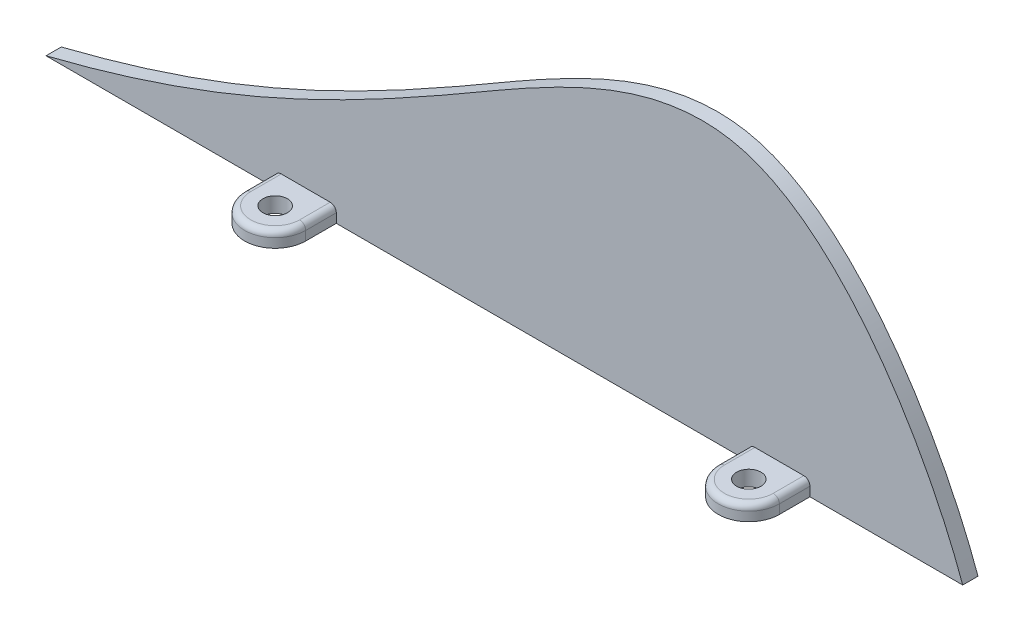
ISO-10303-21;
HEADER;
FILE_DESCRIPTION(('STEP AP214'),'2;1');
FILE_NAME('part.step','',(''),(''),'','','');
FILE_SCHEMA(('AUTOMOTIVE_DESIGN { 1 0 10303 214 1 1 1 1 }'));
ENDSEC;
DATA;
#1=APPLICATION_CONTEXT('core data for automotive mechanical design processes');
#2=APPLICATION_PROTOCOL_DEFINITION('international standard','automotive_design',2000,#1);
#3=PRODUCT_CONTEXT('',#1,'mechanical');
#4=PRODUCT('Part','Part','',(#3));
#5=PRODUCT_RELATED_PRODUCT_CATEGORY('part','',(#4));
#6=PRODUCT_DEFINITION_FORMATION('','',#4);
#7=PRODUCT_DEFINITION_CONTEXT('part definition',#1,'design');
#8=PRODUCT_DEFINITION('design','',#6,#7);
#9=PRODUCT_DEFINITION_SHAPE('','',#8);
#10=(LENGTH_UNIT() NAMED_UNIT(*) SI_UNIT(.MILLI.,.METRE.));
#11=(NAMED_UNIT(*) PLANE_ANGLE_UNIT() SI_UNIT($,.RADIAN.));
#12=(NAMED_UNIT(*) SI_UNIT($,.STERADIAN.) SOLID_ANGLE_UNIT());
#13=UNCERTAINTY_MEASURE_WITH_UNIT(LENGTH_MEASURE(1.E-05),#10,'distance_accuracy_value','');
#14=(GEOMETRIC_REPRESENTATION_CONTEXT(3) GLOBAL_UNCERTAINTY_ASSIGNED_CONTEXT((#13)) GLOBAL_UNIT_ASSIGNED_CONTEXT((#10,
#11,#12)) REPRESENTATION_CONTEXT('',''));
#15=CARTESIAN_POINT('',(0.,0.,0.));
#16=DIRECTION('',(0.,0.,1.));
#17=DIRECTION('',(1.,0.,0.));
#18=AXIS2_PLACEMENT_3D('',#15,#16,#17);
#19=CARTESIAN_POINT('',(36.,-15.5,-4.));
#20=DIRECTION('',(0.,-1.,0.));
#21=DIRECTION('',(0.,0.,-1.));
#22=AXIS2_PLACEMENT_3D('',#19,#20,#21);
#23=CYLINDRICAL_SURFACE('',#22,4.);
#24=DIRECTION('',(0.,-1.,0.));
#25=VECTOR('',#24,1.);
#26=CARTESIAN_POINT('',(32.,-17.5,-4.));
#27=LINE('',#26,#25);
#28=CARTESIAN_POINT('',(32.,-16.3,-4.));
#29=VERTEX_POINT('',#28);
#30=CARTESIAN_POINT('',(32.,-17.5,-4.));
#31=VERTEX_POINT('',#30);
#32=EDGE_CURVE('E275',#29,#31,#27,.T.);
#33=ORIENTED_EDGE('',*,*,#32,.F.);
#34=CARTESIAN_POINT('',(36.,-16.3,-4.));
#35=DIRECTION('',(0.,1.,0.));
#36=DIRECTION('',(-1.,0.,0.));
#37=AXIS2_PLACEMENT_3D('',#34,#35,#36);
#38=CIRCLE('',#37,4.);
#39=CARTESIAN_POINT('',(40.,-16.3,-4.));
#40=VERTEX_POINT('',#39);
#41=EDGE_CURVE('E323',#29,#40,#38,.F.);
#42=ORIENTED_EDGE('',*,*,#41,.T.);
#43=DIRECTION('',(0.,-1.,0.));
#44=VECTOR('',#43,1.);
#45=CARTESIAN_POINT('',(40.,-17.5,-4.));
#46=LINE('',#45,#44);
#47=CARTESIAN_POINT('',(40.,-17.5,-4.));
#48=VERTEX_POINT('',#47);
#49=EDGE_CURVE('E277',#48,#40,#46,.F.);
#50=ORIENTED_EDGE('',*,*,#49,.F.);
#51=CARTESIAN_POINT('',(36.,-17.5,-4.));
#52=DIRECTION('',(0.,1.,0.));
#53=DIRECTION('',(0.,0.,1.));
#54=AXIS2_PLACEMENT_3D('',#51,#52,#53);
#55=CIRCLE('',#54,4.);
#56=EDGE_CURVE('E280',#31,#48,#55,.F.);
#57=ORIENTED_EDGE('',*,*,#56,.F.);
#58=EDGE_LOOP('',(#33,#42,#50,#57));
#59=FACE_BOUND('',#58,.T.);
#60=ADVANCED_FACE('F35',(#59),#23,.T.);
#61=CARTESIAN_POINT('',(-26.,-15.5,-4.));
#62=DIRECTION('',(0.,-1.,0.));
#63=DIRECTION('',(0.,0.,-1.));
#64=AXIS2_PLACEMENT_3D('',#61,#62,#63);
#65=CYLINDRICAL_SURFACE('',#64,4.);
#66=DIRECTION('',(0.,-1.,0.));
#67=VECTOR('',#66,1.);
#68=CARTESIAN_POINT('',(-30.,-17.5,-4.));
#69=LINE('',#68,#67);
#70=CARTESIAN_POINT('',(-30.,-16.3,-4.));
#71=VERTEX_POINT('',#70);
#72=CARTESIAN_POINT('',(-30.,-17.5,-4.));
#73=VERTEX_POINT('',#72);
#74=EDGE_CURVE('E270',#71,#73,#69,.T.);
#75=ORIENTED_EDGE('',*,*,#74,.F.);
#76=CARTESIAN_POINT('',(-26.,-16.3,-4.));
#77=DIRECTION('',(0.,1.,0.));
#78=DIRECTION('',(-1.,0.,0.));
#79=AXIS2_PLACEMENT_3D('',#76,#77,#78);
#80=CIRCLE('',#79,4.);
#81=CARTESIAN_POINT('',(-22.,-16.3,-4.));
#82=VERTEX_POINT('',#81);
#83=EDGE_CURVE('E325',#71,#82,#80,.F.);
#84=ORIENTED_EDGE('',*,*,#83,.T.);
#85=DIRECTION('',(0.,-1.,0.));
#86=VECTOR('',#85,1.);
#87=CARTESIAN_POINT('',(-22.,-17.5,-4.));
#88=LINE('',#87,#86);
#89=CARTESIAN_POINT('',(-22.,-17.5,-4.));
#90=VERTEX_POINT('',#89);
#91=EDGE_CURVE('E272',#90,#82,#88,.F.);
#92=ORIENTED_EDGE('',*,*,#91,.F.);
#93=CARTESIAN_POINT('',(-26.,-17.5,-4.));
#94=DIRECTION('',(0.,1.,0.));
#95=DIRECTION('',(0.,0.,1.));
#96=AXIS2_PLACEMENT_3D('',#93,#94,#95);
#97=CIRCLE('',#96,4.);
#98=EDGE_CURVE('E218',#73,#90,#97,.F.);
#99=ORIENTED_EDGE('',*,*,#98,.F.);
#100=EDGE_LOOP('',(#75,#84,#92,#99));
#101=FACE_BOUND('',#100,.T.);
#102=ADVANCED_FACE('F439',(#101),#65,.T.);
#103=CARTESIAN_POINT('',(36.,-17.5,6.));
#104=DIRECTION('',(0.,-1.,0.));
#105=DIRECTION('',(0.,0.,-1.));
#106=AXIS2_PLACEMENT_3D('',#103,#104,#105);
#107=CYLINDRICAL_SURFACE('',#106,4.);
#108=DIRECTION('',(0.,1.,0.));
#109=VECTOR('',#108,1.);
#110=CARTESIAN_POINT('',(40.,-17.5,6.));
#111=LINE('',#110,#109);
#112=CARTESIAN_POINT('',(40.,-16.3,6.));
#113=VERTEX_POINT('',#112);
#114=CARTESIAN_POINT('',(40.,-17.5,6.));
#115=VERTEX_POINT('',#114);
#116=EDGE_CURVE('E266',#113,#115,#111,.F.);
#117=ORIENTED_EDGE('',*,*,#116,.F.);
#118=CARTESIAN_POINT('',(36.,-16.3,6.));
#119=DIRECTION('',(0.,-1.,0.));
#120=DIRECTION('',(1.,0.,0.));
#121=AXIS2_PLACEMENT_3D('',#118,#119,#120);
#122=CIRCLE('',#121,4.);
#123=CARTESIAN_POINT('',(32.,-16.3,6.));
#124=VERTEX_POINT('',#123);
#125=EDGE_CURVE('E327',#113,#124,#122,.T.);
#126=ORIENTED_EDGE('',*,*,#125,.T.);
#127=DIRECTION('',(0.,1.,0.));
#128=VECTOR('',#127,1.);
#129=CARTESIAN_POINT('',(32.,-17.5,6.));
#130=LINE('',#129,#128);
#131=CARTESIAN_POINT('',(32.,-17.5,6.));
#132=VERTEX_POINT('',#131);
#133=EDGE_CURVE('E263',#132,#124,#130,.T.);
#134=ORIENTED_EDGE('',*,*,#133,.F.);
#135=CARTESIAN_POINT('',(36.,-17.5,6.));
#136=DIRECTION('',(0.,1.,0.));
#137=DIRECTION('',(0.,0.,1.));
#138=AXIS2_PLACEMENT_3D('',#135,#136,#137);
#139=CIRCLE('',#138,4.);
#140=EDGE_CURVE('E268',#115,#132,#139,.F.);
#141=ORIENTED_EDGE('',*,*,#140,.F.);
#142=EDGE_LOOP('',(#117,#126,#134,#141));
#143=FACE_BOUND('',#142,.T.);
#144=ADVANCED_FACE('F432',(#143),#107,.T.);
#145=CARTESIAN_POINT('',(-26.,-17.5,6.));
#146=DIRECTION('',(0.,-1.,0.));
#147=DIRECTION('',(0.,0.,-1.));
#148=AXIS2_PLACEMENT_3D('',#145,#146,#147);
#149=CYLINDRICAL_SURFACE('',#148,4.);
#150=DIRECTION('',(0.,1.,0.));
#151=VECTOR('',#150,1.);
#152=CARTESIAN_POINT('',(-22.,-17.5,6.));
#153=LINE('',#152,#151);
#154=CARTESIAN_POINT('',(-22.,-16.3,6.));
#155=VERTEX_POINT('',#154);
#156=CARTESIAN_POINT('',(-22.,-17.5,6.));
#157=VERTEX_POINT('',#156);
#158=EDGE_CURVE('E259',#155,#157,#153,.F.);
#159=ORIENTED_EDGE('',*,*,#158,.F.);
#160=CARTESIAN_POINT('',(-26.,-16.3,6.));
#161=DIRECTION('',(0.,-1.,0.));
#162=DIRECTION('',(1.,0.,0.));
#163=AXIS2_PLACEMENT_3D('',#160,#161,#162);
#164=CIRCLE('',#163,4.);
#165=CARTESIAN_POINT('',(-30.,-16.3,6.));
#166=VERTEX_POINT('',#165);
#167=EDGE_CURVE('E329',#155,#166,#164,.T.);
#168=ORIENTED_EDGE('',*,*,#167,.T.);
#169=DIRECTION('',(0.,1.,0.));
#170=VECTOR('',#169,1.);
#171=CARTESIAN_POINT('',(-30.,-17.5,6.));
#172=LINE('',#171,#170);
#173=CARTESIAN_POINT('',(-30.,-17.5,6.));
#174=VERTEX_POINT('',#173);
#175=EDGE_CURVE('E256',#174,#166,#172,.T.);
#176=ORIENTED_EDGE('',*,*,#175,.F.);
#177=CARTESIAN_POINT('',(-26.,-17.5,6.));
#178=DIRECTION('',(0.,1.,0.));
#179=DIRECTION('',(0.,0.,1.));
#180=AXIS2_PLACEMENT_3D('',#177,#178,#179);
#181=CIRCLE('',#180,4.);
#182=EDGE_CURVE('E261',#157,#174,#181,.F.);
#183=ORIENTED_EDGE('',*,*,#182,.F.);
#184=EDGE_LOOP('',(#159,#168,#176,#183));
#185=FACE_BOUND('',#184,.T.);
#186=ADVANCED_FACE('F425',(#185),#149,.T.);
#187=CARTESIAN_POINT('',(40.,-15.5,10.));
#188=DIRECTION('',(0.,-1.,0.));
#189=DIRECTION('',(1.,0.,0.));
#190=AXIS2_PLACEMENT_3D('',#187,#188,#189);
#191=PLANE('',#190);
#192=DIRECTION('',(-1.,0.,0.));
#193=VECTOR('',#192,1.);
#194=CARTESIAN_POINT('',(40.,-15.5,2.));
#195=LINE('',#194,#193);
#196=CARTESIAN_POINT('',(39.2,-15.5,2.));
#197=VERTEX_POINT('',#196);
#198=CARTESIAN_POINT('',(32.8,-15.5,2.));
#199=VERTEX_POINT('',#198);
#200=EDGE_CURVE('E399',#197,#199,#195,.T.);
#201=ORIENTED_EDGE('',*,*,#200,.T.);
#202=DIRECTION('',(0.,0.,-1.));
#203=VECTOR('',#202,1.);
#204=CARTESIAN_POINT('',(32.8,-15.5,10.));
#205=LINE('',#204,#203);
#206=CARTESIAN_POINT('',(32.8,-15.5,6.));
#207=VERTEX_POINT('',#206);
#208=EDGE_CURVE('E309',#199,#207,#205,.F.);
#209=ORIENTED_EDGE('',*,*,#208,.T.);
#210=CARTESIAN_POINT('',(36.,-15.5,6.));
#211=DIRECTION('',(0.,-1.,0.));
#212=DIRECTION('',(1.,0.,0.));
#213=AXIS2_PLACEMENT_3D('',#210,#211,#212);
#214=CIRCLE('',#213,3.2);
#215=CARTESIAN_POINT('',(39.2,-15.5,6.));
#216=VERTEX_POINT('',#215);
#217=EDGE_CURVE('E305',#207,#216,#214,.F.);
#218=ORIENTED_EDGE('',*,*,#217,.T.);
#219=DIRECTION('',(0.,0.,-1.));
#220=VECTOR('',#219,1.);
#221=CARTESIAN_POINT('',(39.2,-15.5,10.));
#222=LINE('',#221,#220);
#223=EDGE_CURVE('E307',#216,#197,#222,.T.);
#224=ORIENTED_EDGE('',*,*,#223,.T.);
#225=EDGE_LOOP('',(#201,#209,#218,#224));
#226=FACE_BOUND('',#225,.T.);
#227=CARTESIAN_POINT('',(36.,-15.5,6.));
#228=DIRECTION('',(0.,1.,0.));
#229=DIRECTION('',(0.,0.,1.));
#230=AXIS2_PLACEMENT_3D('',#227,#228,#229);
#231=CIRCLE('',#230,1.6);
#232=CARTESIAN_POINT('',(36.,-15.5,7.6));
#233=VERTEX_POINT('',#232);
#234=EDGE_CURVE('E794',#233,#233,#231,.T.);
#235=ORIENTED_EDGE('',*,*,#234,.F.);
#236=EDGE_LOOP('',(#235));
#237=FACE_BOUND('',#236,.T.);
#238=ADVANCED_FACE('F431',(#226,#237),#191,.F.);
#239=CARTESIAN_POINT('',(0.,0.,2.));
#240=DIRECTION('',(0.,0.,1.));
#241=DIRECTION('',(1.,0.,0.));
#242=AXIS2_PLACEMENT_3D('',#239,#240,#241);
#243=PLANE('',#242);
#244=DIRECTION('',(-1.,0.,0.));
#245=VECTOR('',#244,1.);
#246=CARTESIAN_POINT('',(-22.,-15.5,2.));
#247=LINE('',#246,#245);
#248=CARTESIAN_POINT('',(-22.8,-15.5,2.));
#249=VERTEX_POINT('',#248);
#250=CARTESIAN_POINT('',(-29.2,-15.5,2.));
#251=VERTEX_POINT('',#250);
#252=EDGE_CURVE('E380',#249,#251,#247,.T.);
#253=ORIENTED_EDGE('',*,*,#252,.F.);
#254=CARTESIAN_POINT('',(-22.8,-16.3,2.));
#255=DIRECTION('',(0.,0.,1.));
#256=DIRECTION('',(1.,0.,0.));
#257=AXIS2_PLACEMENT_3D('',#254,#255,#256);
#258=CIRCLE('',#257,0.8);
#259=CARTESIAN_POINT('',(-22.,-16.3,2.));
#260=VERTEX_POINT('',#259);
#261=EDGE_CURVE('E11',#249,#260,#258,.F.);
#262=ORIENTED_EDGE('',*,*,#261,.T.);
#263=DIRECTION('',(0.,1.,0.));
#264=VECTOR('',#263,1.);
#265=CARTESIAN_POINT('',(-22.,-17.5,2.));
#266=LINE('',#265,#264);
#267=CARTESIAN_POINT('',(-22.,-17.5,2.));
#268=VERTEX_POINT('',#267);
#269=EDGE_CURVE('E384',#268,#260,#266,.T.);
#270=ORIENTED_EDGE('',*,*,#269,.F.);
#271=DIRECTION('',(1.,0.,0.));
#272=VECTOR('',#271,1.);
#273=CARTESIAN_POINT('',(0.,-17.5,2.));
#274=LINE('',#273,#272);
#275=CARTESIAN_POINT('',(32.,-17.5,2.));
#276=VERTEX_POINT('',#275);
#277=EDGE_CURVE('E875',#268,#276,#274,.T.);
#278=ORIENTED_EDGE('',*,*,#277,.T.);
#279=DIRECTION('',(0.,-1.,0.));
#280=VECTOR('',#279,1.);
#281=CARTESIAN_POINT('',(32.,-17.5,2.));
#282=LINE('',#281,#280);
#283=CARTESIAN_POINT('',(32.,-16.3,2.));
#284=VERTEX_POINT('',#283);
#285=EDGE_CURVE('E402',#284,#276,#282,.T.);
#286=ORIENTED_EDGE('',*,*,#285,.F.);
#287=CARTESIAN_POINT('',(32.8,-16.3,2.));
#288=DIRECTION('',(0.,0.,1.));
#289=DIRECTION('',(1.,0.,0.));
#290=AXIS2_PLACEMENT_3D('',#287,#288,#289);
#291=CIRCLE('',#290,0.8);
#292=EDGE_CURVE('E339',#284,#199,#291,.F.);
#293=ORIENTED_EDGE('',*,*,#292,.T.);
#294=ORIENTED_EDGE('',*,*,#200,.F.);
#295=CARTESIAN_POINT('',(39.2,-16.3,2.));
#296=DIRECTION('',(0.,0.,1.));
#297=DIRECTION('',(1.,0.,0.));
#298=AXIS2_PLACEMENT_3D('',#295,#296,#297);
#299=CIRCLE('',#298,0.8);
#300=CARTESIAN_POINT('',(40.,-16.3,2.));
#301=VERTEX_POINT('',#300);
#302=EDGE_CURVE('E341',#197,#301,#299,.F.);
#303=ORIENTED_EDGE('',*,*,#302,.T.);
#304=DIRECTION('',(0.,1.,0.));
#305=VECTOR('',#304,1.);
#306=CARTESIAN_POINT('',(40.,-17.5,2.));
#307=LINE('',#306,#305);
#308=CARTESIAN_POINT('',(40.,-17.5,2.));
#309=VERTEX_POINT('',#308);
#310=EDGE_CURVE('E396',#309,#301,#307,.T.);
#311=ORIENTED_EDGE('',*,*,#310,.F.);
#312=CARTESIAN_POINT('',(60.,-17.5,2.));
#313=VERTEX_POINT('',#312);
#314=EDGE_CURVE('E413',#309,#313,#274,.T.);
#315=ORIENTED_EDGE('',*,*,#314,.T.);
#316=CARTESIAN_POINT('',(-60.,-17.5,2.));
#317=CARTESIAN_POINT('',(-39.1599568451472,-12.2933840497621,2.));
#318=CARTESIAN_POINT('',(-14.3090729139939,-0.698288992830104,2.));
#319=CARTESIAN_POINT('',(35.2794238795256,30.576035889302,2.));
#320=CARTESIAN_POINT('',(55.7556276237162,-5.63118190526074,2.));
#321=CARTESIAN_POINT('',(60.,-17.5,2.));
#322=B_SPLINE_CURVE_WITH_KNOTS('',3,(#316,#317,#318,#319,#320,#321),.UNSPECIFIED.,.F.,.F.,(4,1,
1,4),(0.,0.404702992738193,0.677892972972872,1.),.UNSPECIFIED.);
#323=CARTESIAN_POINT('',(-60.,-17.5,2.));
#324=VERTEX_POINT('',#323);
#325=EDGE_CURVE('E243',#324,#313,#322,.T.);
#326=ORIENTED_EDGE('',*,*,#325,.F.);
#327=CARTESIAN_POINT('',(-30.,-17.5,2.));
#328=VERTEX_POINT('',#327);
#329=EDGE_CURVE('E254',#324,#328,#274,.T.);
#330=ORIENTED_EDGE('',*,*,#329,.T.);
#331=DIRECTION('',(0.,-1.,0.));
#332=VECTOR('',#331,1.);
#333=CARTESIAN_POINT('',(-30.,-17.5,2.));
#334=LINE('',#333,#332);
#335=CARTESIAN_POINT('',(-30.,-16.3,2.));
#336=VERTEX_POINT('',#335);
#337=EDGE_CURVE('E383',#336,#328,#334,.T.);
#338=ORIENTED_EDGE('',*,*,#337,.F.);
#339=CARTESIAN_POINT('',(-29.2,-16.3,2.));
#340=DIRECTION('',(0.,0.,1.));
#341=DIRECTION('',(1.,0.,0.));
#342=AXIS2_PLACEMENT_3D('',#339,#340,#341);
#343=CIRCLE('',#342,0.8);
#344=EDGE_CURVE('E44',#336,#251,#343,.F.);
#345=ORIENTED_EDGE('',*,*,#344,.T.);
#346=EDGE_LOOP('',(#253,#262,#270,#278,#286,#293,#294,#303,#311,#315,#326,#330,#338,#345));
#347=FACE_BOUND('',#346,.T.);
#348=ADVANCED_FACE('F381',(#347),#243,.T.);
#349=DIRECTION('',(0.,0.,-1.));
#350=VECTOR('',#349,1.);
#351=SURFACE_OF_LINEAR_EXTRUSION('',#322,#350);
#352=CARTESIAN_POINT('',(-60.,-17.5,0.));
#353=CARTESIAN_POINT('',(-39.1599568451472,-12.2933840497621,0.));
#354=CARTESIAN_POINT('',(-14.3090729139939,-0.698288992830104,0.));
#355=CARTESIAN_POINT('',(35.2794238795256,30.576035889302,0.));
#356=CARTESIAN_POINT('',(55.7556276237162,-5.63118190526074,0.));
#357=CARTESIAN_POINT('',(60.,-17.5,0.));
#358=B_SPLINE_CURVE_WITH_KNOTS('',3,(#352,#353,#354,#355,#356,#357),.UNSPECIFIED.,.F.,.F.,(4,1,
1,4),(0.,0.404702992738193,0.677892972972872,1.),.UNSPECIFIED.);
#359=CARTESIAN_POINT('',(-60.,-17.5,0.));
#360=VERTEX_POINT('',#359);
#361=CARTESIAN_POINT('',(60.,-17.5,0.));
#362=VERTEX_POINT('',#361);
#363=EDGE_CURVE('E244',#360,#362,#358,.T.);
#364=ORIENTED_EDGE('',*,*,#363,.F.);
#365=DIRECTION('',(0.,0.,-1.));
#366=VECTOR('',#365,1.);
#367=CARTESIAN_POINT('',(-60.,-17.5,2.));
#368=LINE('',#367,#366);
#369=EDGE_CURVE('E253',#324,#360,#368,.T.);
#370=ORIENTED_EDGE('',*,*,#369,.F.);
#371=ORIENTED_EDGE('',*,*,#325,.T.);
#372=DIRECTION('',(0.,0.,-1.));
#373=VECTOR('',#372,1.);
#374=CARTESIAN_POINT('',(60.,-17.5,2.));
#375=LINE('',#374,#373);
#376=EDGE_CURVE('E250',#313,#362,#375,.T.);
#377=ORIENTED_EDGE('',*,*,#376,.T.);
#378=EDGE_LOOP('',(#364,#370,#371,#377));
#379=FACE_BOUND('',#378,.T.);
#380=ADVANCED_FACE('F418',(#379),#351,.T.);
#381=CARTESIAN_POINT('',(0.,-17.5,2.));
#382=DIRECTION('',(0.,1.,0.));
#383=DIRECTION('',(0.,0.,1.));
#384=AXIS2_PLACEMENT_3D('',#381,#382,#383);
#385=PLANE('',#384);
#386=CARTESIAN_POINT('',(-26.,-17.5,-4.));
#387=DIRECTION('',(0.,1.,0.));
#388=DIRECTION('',(0.,0.,1.));
#389=AXIS2_PLACEMENT_3D('',#386,#387,#388);
#390=CIRCLE('',#389,1.6);
#391=CARTESIAN_POINT('',(-26.,-17.5,-2.4));
#392=VERTEX_POINT('',#391);
#393=EDGE_CURVE('E826',#392,#392,#390,.T.);
#394=ORIENTED_EDGE('',*,*,#393,.T.);
#395=EDGE_LOOP('',(#394));
#396=FACE_BOUND('',#395,.T.);
#397=CARTESIAN_POINT('',(36.,-17.5,-4.));
#398=DIRECTION('',(0.,1.,0.));
#399=DIRECTION('',(0.,0.,1.));
#400=AXIS2_PLACEMENT_3D('',#397,#398,#399);
#401=CIRCLE('',#400,1.6);
#402=CARTESIAN_POINT('',(36.,-17.5,-2.4));
#403=VERTEX_POINT('',#402);
#404=EDGE_CURVE('E233',#403,#403,#401,.T.);
#405=ORIENTED_EDGE('',*,*,#404,.T.);
#406=EDGE_LOOP('',(#405));
#407=FACE_BOUND('',#406,.T.);
#408=CARTESIAN_POINT('',(-26.,-17.5,6.));
#409=DIRECTION('',(0.,1.,0.));
#410=DIRECTION('',(0.,0.,1.));
#411=AXIS2_PLACEMENT_3D('',#408,#409,#410);
#412=CIRCLE('',#411,1.6);
#413=CARTESIAN_POINT('',(-26.,-17.5,7.6));
#414=VERTEX_POINT('',#413);
#415=EDGE_CURVE('E796',#414,#414,#412,.T.);
#416=ORIENTED_EDGE('',*,*,#415,.T.);
#417=EDGE_LOOP('',(#416));
#418=FACE_BOUND('',#417,.T.);
#419=CARTESIAN_POINT('',(36.,-17.5,6.));
#420=DIRECTION('',(0.,1.,0.));
#421=DIRECTION('',(0.,0.,1.));
#422=AXIS2_PLACEMENT_3D('',#419,#420,#421);
#423=CIRCLE('',#422,1.6);
#424=CARTESIAN_POINT('',(36.,-17.5,7.6));
#425=VERTEX_POINT('',#424);
#426=EDGE_CURVE('E388',#425,#425,#423,.T.);
#427=ORIENTED_EDGE('',*,*,#426,.T.);
#428=EDGE_LOOP('',(#427));
#429=FACE_BOUND('',#428,.T.);
#430=DIRECTION('',(0.,0.,1.));
#431=VECTOR('',#430,1.);
#432=CARTESIAN_POINT('',(32.,-17.5,-8.));
#433=LINE('',#432,#431);
#434=CARTESIAN_POINT('',(32.,-17.5,0.));
#435=VERTEX_POINT('',#434);
#436=EDGE_CURVE('E807',#31,#435,#433,.T.);
#437=ORIENTED_EDGE('',*,*,#436,.F.);
#438=ORIENTED_EDGE('',*,*,#56,.T.);
#439=DIRECTION('',(0.,0.,1.));
#440=VECTOR('',#439,1.);
#441=CARTESIAN_POINT('',(40.,-17.5,-8.));
#442=LINE('',#441,#440);
#443=CARTESIAN_POINT('',(40.,-17.5,0.));
#444=VERTEX_POINT('',#443);
#445=EDGE_CURVE('E805',#48,#444,#442,.T.);
#446=ORIENTED_EDGE('',*,*,#445,.T.);
#447=DIRECTION('',(1.,0.,0.));
#448=VECTOR('',#447,1.);
#449=CARTESIAN_POINT('',(0.,-17.5,0.));
#450=LINE('',#449,#448);
#451=EDGE_CURVE('E240',#444,#362,#450,.T.);
#452=ORIENTED_EDGE('',*,*,#451,.T.);
#453=ORIENTED_EDGE('',*,*,#376,.F.);
#454=ORIENTED_EDGE('',*,*,#314,.F.);
#455=DIRECTION('',(0.,0.,-1.));
#456=VECTOR('',#455,1.);
#457=CARTESIAN_POINT('',(40.,-17.5,10.));
#458=LINE('',#457,#456);
#459=EDGE_CURVE('E404',#115,#309,#458,.T.);
#460=ORIENTED_EDGE('',*,*,#459,.F.);
#461=ORIENTED_EDGE('',*,*,#140,.T.);
#462=DIRECTION('',(0.,0.,-1.));
#463=VECTOR('',#462,1.);
#464=CARTESIAN_POINT('',(32.,-17.5,10.));
#465=LINE('',#464,#463);
#466=EDGE_CURVE('E406',#132,#276,#465,.T.);
#467=ORIENTED_EDGE('',*,*,#466,.T.);
#468=ORIENTED_EDGE('',*,*,#277,.F.);
#469=DIRECTION('',(0.,0.,-1.));
#470=VECTOR('',#469,1.);
#471=CARTESIAN_POINT('',(-22.,-17.5,10.));
#472=LINE('',#471,#470);
#473=EDGE_CURVE('E386',#157,#268,#472,.T.);
#474=ORIENTED_EDGE('',*,*,#473,.F.);
#475=ORIENTED_EDGE('',*,*,#182,.T.);
#476=DIRECTION('',(0.,0.,-1.));
#477=VECTOR('',#476,1.);
#478=CARTESIAN_POINT('',(-30.,-17.5,10.));
#479=LINE('',#478,#477);
#480=EDGE_CURVE('E393',#174,#328,#479,.T.);
#481=ORIENTED_EDGE('',*,*,#480,.T.);
#482=ORIENTED_EDGE('',*,*,#329,.F.);
#483=ORIENTED_EDGE('',*,*,#369,.T.);
#484=CARTESIAN_POINT('',(-30.,-17.5,0.));
#485=VERTEX_POINT('',#484);
#486=EDGE_CURVE('E239',#360,#485,#450,.T.);
#487=ORIENTED_EDGE('',*,*,#486,.T.);
#488=DIRECTION('',(0.,0.,1.));
#489=VECTOR('',#488,1.);
#490=CARTESIAN_POINT('',(-30.,-17.5,-8.));
#491=LINE('',#490,#489);
#492=EDGE_CURVE('E223',#73,#485,#491,.T.);
#493=ORIENTED_EDGE('',*,*,#492,.F.);
#494=ORIENTED_EDGE('',*,*,#98,.T.);
#495=DIRECTION('',(0.,0.,1.));
#496=VECTOR('',#495,1.);
#497=CARTESIAN_POINT('',(-22.,-17.5,-8.));
#498=LINE('',#497,#496);
#499=CARTESIAN_POINT('',(-22.,-17.5,0.));
#500=VERTEX_POINT('',#499);
#501=EDGE_CURVE('E210',#90,#500,#498,.T.);
#502=ORIENTED_EDGE('',*,*,#501,.T.);
#503=EDGE_CURVE('E215',#500,#435,#450,.T.);
#504=ORIENTED_EDGE('',*,*,#503,.T.);
#505=EDGE_LOOP('',(#437,#438,#446,#452,#453,#454,#460,#461,#467,#468,#474,#475,#481,#482,#483,
#487,#493,#494,#502,#504));
#506=FACE_BOUND('',#505,.T.);
#507=ADVANCED_FACE('F213',(#396,#407,#418,#429,#506),#385,.F.);
#508=CARTESIAN_POINT('',(0.,0.,0.));
#509=DIRECTION('',(0.,0.,1.));
#510=DIRECTION('',(1.,0.,0.));
#511=AXIS2_PLACEMENT_3D('',#508,#509,#510);
#512=PLANE('',#511);
#513=ORIENTED_EDGE('',*,*,#503,.F.);
#514=DIRECTION('',(0.,1.,0.));
#515=VECTOR('',#514,1.);
#516=CARTESIAN_POINT('',(-22.,-17.5,0.));
#517=LINE('',#516,#515);
#518=CARTESIAN_POINT('',(-22.,-16.3,0.));
#519=VERTEX_POINT('',#518);
#520=EDGE_CURVE('E227',#500,#519,#517,.T.);
#521=ORIENTED_EDGE('',*,*,#520,.T.);
#522=CARTESIAN_POINT('',(-22.8,-16.3,0.));
#523=DIRECTION('',(0.,0.,1.));
#524=DIRECTION('',(1.,0.,0.));
#525=AXIS2_PLACEMENT_3D('',#522,#523,#524);
#526=CIRCLE('',#525,0.8);
#527=CARTESIAN_POINT('',(-22.8,-15.5,0.));
#528=VERTEX_POINT('',#527);
#529=EDGE_CURVE('E335',#519,#528,#526,.T.);
#530=ORIENTED_EDGE('',*,*,#529,.T.);
#531=DIRECTION('',(-1.,0.,0.));
#532=VECTOR('',#531,1.);
#533=CARTESIAN_POINT('',(-22.,-15.5,0.));
#534=LINE('',#533,#532);
#535=CARTESIAN_POINT('',(-29.2,-15.5,0.));
#536=VERTEX_POINT('',#535);
#537=EDGE_CURVE('E817',#528,#536,#534,.T.);
#538=ORIENTED_EDGE('',*,*,#537,.T.);
#539=CARTESIAN_POINT('',(-29.2,-16.3,0.));
#540=DIRECTION('',(0.,0.,1.));
#541=DIRECTION('',(1.,0.,0.));
#542=AXIS2_PLACEMENT_3D('',#539,#540,#541);
#543=CIRCLE('',#542,0.8);
#544=CARTESIAN_POINT('',(-30.,-16.3,0.));
#545=VERTEX_POINT('',#544);
#546=EDGE_CURVE('E337',#536,#545,#543,.T.);
#547=ORIENTED_EDGE('',*,*,#546,.T.);
#548=DIRECTION('',(0.,-1.,0.));
#549=VECTOR('',#548,1.);
#550=CARTESIAN_POINT('',(-30.,-17.5,0.));
#551=LINE('',#550,#549);
#552=EDGE_CURVE('E232',#545,#485,#551,.T.);
#553=ORIENTED_EDGE('',*,*,#552,.T.);
#554=ORIENTED_EDGE('',*,*,#486,.F.);
#555=ORIENTED_EDGE('',*,*,#363,.T.);
#556=ORIENTED_EDGE('',*,*,#451,.F.);
#557=DIRECTION('',(0.,1.,0.));
#558=VECTOR('',#557,1.);
#559=CARTESIAN_POINT('',(40.,-17.5,0.));
#560=LINE('',#559,#558);
#561=CARTESIAN_POINT('',(40.,-16.3,0.));
#562=VERTEX_POINT('',#561);
#563=EDGE_CURVE('E222',#444,#562,#560,.T.);
#564=ORIENTED_EDGE('',*,*,#563,.T.);
#565=CARTESIAN_POINT('',(39.2,-16.3,0.));
#566=DIRECTION('',(0.,0.,1.));
#567=DIRECTION('',(1.,0.,0.));
#568=AXIS2_PLACEMENT_3D('',#565,#566,#567);
#569=CIRCLE('',#568,0.8);
#570=CARTESIAN_POINT('',(39.2,-15.5,0.));
#571=VERTEX_POINT('',#570);
#572=EDGE_CURVE('E331',#562,#571,#569,.T.);
#573=ORIENTED_EDGE('',*,*,#572,.T.);
#574=DIRECTION('',(-1.,0.,0.));
#575=VECTOR('',#574,1.);
#576=CARTESIAN_POINT('',(40.,-15.5,0.));
#577=LINE('',#576,#575);
#578=CARTESIAN_POINT('',(32.8,-15.5,0.));
#579=VERTEX_POINT('',#578);
#580=EDGE_CURVE('E809',#571,#579,#577,.T.);
#581=ORIENTED_EDGE('',*,*,#580,.T.);
#582=CARTESIAN_POINT('',(32.8,-16.3,0.));
#583=DIRECTION('',(0.,0.,1.));
#584=DIRECTION('',(1.,0.,0.));
#585=AXIS2_PLACEMENT_3D('',#582,#583,#584);
#586=CIRCLE('',#585,0.8);
#587=CARTESIAN_POINT('',(32.,-16.3,0.));
#588=VERTEX_POINT('',#587);
#589=EDGE_CURVE('E333',#579,#588,#586,.T.);
#590=ORIENTED_EDGE('',*,*,#589,.T.);
#591=DIRECTION('',(0.,-1.,0.));
#592=VECTOR('',#591,1.);
#593=CARTESIAN_POINT('',(32.,-17.5,0.));
#594=LINE('',#593,#592);
#595=EDGE_CURVE('E237',#588,#435,#594,.T.);
#596=ORIENTED_EDGE('',*,*,#595,.T.);
#597=EDGE_LOOP('',(#513,#521,#530,#538,#547,#553,#554,#555,#556,#564,#573,#581,#590,#596));
#598=FACE_BOUND('',#597,.T.);
#599=ADVANCED_FACE('F235',(#598),#512,.F.);
#600=CARTESIAN_POINT('',(40.,-17.5,10.));
#601=DIRECTION('',(-1.,0.,0.));
#602=DIRECTION('',(0.,0.,1.));
#603=AXIS2_PLACEMENT_3D('',#600,#601,#602);
#604=PLANE('',#603);
#605=ORIENTED_EDGE('',*,*,#310,.T.);
#606=DIRECTION('',(0.,0.,-1.));
#607=VECTOR('',#606,1.);
#608=CARTESIAN_POINT('',(40.,-16.3,10.));
#609=LINE('',#608,#607);
#610=EDGE_CURVE('E311',#301,#113,#609,.F.);
#611=ORIENTED_EDGE('',*,*,#610,.T.);
#612=ORIENTED_EDGE('',*,*,#116,.T.);
#613=ORIENTED_EDGE('',*,*,#459,.T.);
#614=EDGE_LOOP('',(#605,#611,#612,#613));
#615=FACE_BOUND('',#614,.T.);
#616=ADVANCED_FACE('F641',(#615),#604,.F.);
#617=CARTESIAN_POINT('',(32.,-17.5,10.));
#618=DIRECTION('',(1.,0.,0.));
#619=DIRECTION('',(0.,0.,-1.));
#620=AXIS2_PLACEMENT_3D('',#617,#618,#619);
#621=PLANE('',#620);
#622=ORIENTED_EDGE('',*,*,#133,.T.);
#623=DIRECTION('',(0.,0.,-1.));
#624=VECTOR('',#623,1.);
#625=CARTESIAN_POINT('',(32.,-16.3,10.));
#626=LINE('',#625,#624);
#627=EDGE_CURVE('E302',#124,#284,#626,.T.);
#628=ORIENTED_EDGE('',*,*,#627,.T.);
#629=ORIENTED_EDGE('',*,*,#285,.T.);
#630=ORIENTED_EDGE('',*,*,#466,.F.);
#631=EDGE_LOOP('',(#622,#628,#629,#630));
#632=FACE_BOUND('',#631,.T.);
#633=ADVANCED_FACE('F634',(#632),#621,.F.);
#634=CARTESIAN_POINT('',(-22.,-17.5,10.));
#635=DIRECTION('',(-1.,0.,0.));
#636=DIRECTION('',(0.,0.,1.));
#637=AXIS2_PLACEMENT_3D('',#634,#635,#636);
#638=PLANE('',#637);
#639=ORIENTED_EDGE('',*,*,#269,.T.);
#640=DIRECTION('',(0.,0.,-1.));
#641=VECTOR('',#640,1.);
#642=CARTESIAN_POINT('',(-22.,-16.3,10.));
#643=LINE('',#642,#641);
#644=EDGE_CURVE('E57',#260,#155,#643,.F.);
#645=ORIENTED_EDGE('',*,*,#644,.T.);
#646=ORIENTED_EDGE('',*,*,#158,.T.);
#647=ORIENTED_EDGE('',*,*,#473,.T.);
#648=EDGE_LOOP('',(#639,#645,#646,#647));
#649=FACE_BOUND('',#648,.T.);
#650=ADVANCED_FACE('F627',(#649),#638,.F.);
#651=CARTESIAN_POINT('',(-22.,-15.5,10.));
#652=DIRECTION('',(0.,-1.,0.));
#653=DIRECTION('',(1.,0.,0.));
#654=AXIS2_PLACEMENT_3D('',#651,#652,#653);
#655=PLANE('',#654);
#656=ORIENTED_EDGE('',*,*,#252,.T.);
#657=DIRECTION('',(0.,0.,-1.));
#658=VECTOR('',#657,1.);
#659=CARTESIAN_POINT('',(-29.2,-15.5,10.));
#660=LINE('',#659,#658);
#661=CARTESIAN_POINT('',(-29.2,-15.5,6.));
#662=VERTEX_POINT('',#661);
#663=EDGE_CURVE('E320',#251,#662,#660,.F.);
#664=ORIENTED_EDGE('',*,*,#663,.T.);
#665=CARTESIAN_POINT('',(-26.,-15.5,6.));
#666=DIRECTION('',(0.,-1.,0.));
#667=DIRECTION('',(1.,0.,0.));
#668=AXIS2_PLACEMENT_3D('',#665,#666,#667);
#669=CIRCLE('',#668,3.2);
#670=CARTESIAN_POINT('',(-22.8,-15.5,6.));
#671=VERTEX_POINT('',#670);
#672=EDGE_CURVE('E316',#662,#671,#669,.F.);
#673=ORIENTED_EDGE('',*,*,#672,.T.);
#674=DIRECTION('',(0.,0.,-1.));
#675=VECTOR('',#674,1.);
#676=CARTESIAN_POINT('',(-22.8,-15.5,10.));
#677=LINE('',#676,#675);
#678=EDGE_CURVE('E318',#671,#249,#677,.T.);
#679=ORIENTED_EDGE('',*,*,#678,.T.);
#680=EDGE_LOOP('',(#656,#664,#673,#679));
#681=FACE_BOUND('',#680,.T.);
#682=CARTESIAN_POINT('',(-26.,-15.5,6.));
#683=DIRECTION('',(0.,1.,0.));
#684=DIRECTION('',(0.,0.,1.));
#685=AXIS2_PLACEMENT_3D('',#682,#683,#684);
#686=CIRCLE('',#685,1.6);
#687=CARTESIAN_POINT('',(-26.,-15.5,7.6));
#688=VERTEX_POINT('',#687);
#689=EDGE_CURVE('E800',#688,#688,#686,.T.);
#690=ORIENTED_EDGE('',*,*,#689,.F.);
#691=EDGE_LOOP('',(#690));
#692=FACE_BOUND('',#691,.T.);
#693=ADVANCED_FACE('F378',(#681,#692),#655,.F.);
#694=CARTESIAN_POINT('',(-30.,-17.5,10.));
#695=DIRECTION('',(1.,0.,0.));
#696=DIRECTION('',(0.,0.,-1.));
#697=AXIS2_PLACEMENT_3D('',#694,#695,#696);
#698=PLANE('',#697);
#699=ORIENTED_EDGE('',*,*,#175,.T.);
#700=DIRECTION('',(0.,0.,-1.));
#701=VECTOR('',#700,1.);
#702=CARTESIAN_POINT('',(-30.,-16.3,10.));
#703=LINE('',#702,#701);
#704=EDGE_CURVE('E313',#166,#336,#703,.T.);
#705=ORIENTED_EDGE('',*,*,#704,.T.);
#706=ORIENTED_EDGE('',*,*,#337,.T.);
#707=ORIENTED_EDGE('',*,*,#480,.F.);
#708=EDGE_LOOP('',(#699,#705,#706,#707));
#709=FACE_BOUND('',#708,.T.);
#710=ADVANCED_FACE('F612',(#709),#698,.F.);
#711=CARTESIAN_POINT('',(36.,-15.5,6.));
#712=DIRECTION('',(0.,1.,0.));
#713=DIRECTION('',(0.,0.,1.));
#714=AXIS2_PLACEMENT_3D('',#711,#712,#713);
#715=CYLINDRICAL_SURFACE('',#714,1.6);
#716=ORIENTED_EDGE('',*,*,#426,.F.);
#717=EDGE_LOOP('',(#716));
#718=FACE_BOUND('',#717,.T.);
#719=ORIENTED_EDGE('',*,*,#234,.T.);
#720=EDGE_LOOP('',(#719));
#721=FACE_BOUND('',#720,.T.);
#722=ADVANCED_FACE('F604',(#718,#721),#715,.F.);
#723=CARTESIAN_POINT('',(-26.,-15.5,6.));
#724=DIRECTION('',(0.,1.,0.));
#725=DIRECTION('',(0.,0.,1.));
#726=AXIS2_PLACEMENT_3D('',#723,#724,#725);
#727=CYLINDRICAL_SURFACE('',#726,1.6);
#728=ORIENTED_EDGE('',*,*,#415,.F.);
#729=EDGE_LOOP('',(#728));
#730=FACE_BOUND('',#729,.T.);
#731=ORIENTED_EDGE('',*,*,#689,.T.);
#732=EDGE_LOOP('',(#731));
#733=FACE_BOUND('',#732,.T.);
#734=ADVANCED_FACE('F595',(#730,#733),#727,.F.);
#735=CARTESIAN_POINT('',(40.,-17.5,-8.));
#736=DIRECTION('',(1.,0.,0.));
#737=DIRECTION('',(0.,0.,-1.));
#738=AXIS2_PLACEMENT_3D('',#735,#736,#737);
#739=PLANE('',#738);
#740=ORIENTED_EDGE('',*,*,#49,.T.);
#741=DIRECTION('',(0.,0.,1.));
#742=VECTOR('',#741,1.);
#743=CARTESIAN_POINT('',(40.,-16.3,-8.));
#744=LINE('',#743,#742);
#745=EDGE_CURVE('E282',#40,#562,#744,.T.);
#746=ORIENTED_EDGE('',*,*,#745,.T.);
#747=ORIENTED_EDGE('',*,*,#563,.F.);
#748=ORIENTED_EDGE('',*,*,#445,.F.);
#749=EDGE_LOOP('',(#740,#746,#747,#748));
#750=FACE_BOUND('',#749,.T.);
#751=ADVANCED_FACE('F587',(#750),#739,.T.);
#752=CARTESIAN_POINT('',(32.,-17.5,-8.));
#753=DIRECTION('',(-1.,0.,0.));
#754=DIRECTION('',(0.,0.,1.));
#755=AXIS2_PLACEMENT_3D('',#752,#753,#754);
#756=PLANE('',#755);
#757=ORIENTED_EDGE('',*,*,#595,.F.);
#758=DIRECTION('',(0.,0.,1.));
#759=VECTOR('',#758,1.);
#760=CARTESIAN_POINT('',(32.,-16.3,-8.));
#761=LINE('',#760,#759);
#762=EDGE_CURVE('E291',#588,#29,#761,.F.);
#763=ORIENTED_EDGE('',*,*,#762,.T.);
#764=ORIENTED_EDGE('',*,*,#32,.T.);
#765=ORIENTED_EDGE('',*,*,#436,.T.);
#766=EDGE_LOOP('',(#757,#763,#764,#765));
#767=FACE_BOUND('',#766,.T.);
#768=ADVANCED_FACE('F579',(#767),#756,.T.);
#769=CARTESIAN_POINT('',(40.,-15.5,-8.));
#770=DIRECTION('',(0.,1.,0.));
#771=DIRECTION('',(-1.,0.,0.));
#772=AXIS2_PLACEMENT_3D('',#769,#770,#771);
#773=PLANE('',#772);
#774=ORIENTED_EDGE('',*,*,#580,.F.);
#775=DIRECTION('',(0.,0.,1.));
#776=VECTOR('',#775,1.);
#777=CARTESIAN_POINT('',(39.2,-15.5,-8.));
#778=LINE('',#777,#776);
#779=CARTESIAN_POINT('',(39.2,-15.5,-4.));
#780=VERTEX_POINT('',#779);
#781=EDGE_CURVE('E289',#571,#780,#778,.F.);
#782=ORIENTED_EDGE('',*,*,#781,.T.);
#783=CARTESIAN_POINT('',(36.,-15.5,-4.));
#784=DIRECTION('',(0.,1.,0.));
#785=DIRECTION('',(-1.,0.,0.));
#786=AXIS2_PLACEMENT_3D('',#783,#784,#785);
#787=CIRCLE('',#786,3.2);
#788=CARTESIAN_POINT('',(32.8,-15.5,-4.));
#789=VERTEX_POINT('',#788);
#790=EDGE_CURVE('E285',#780,#789,#787,.T.);
#791=ORIENTED_EDGE('',*,*,#790,.T.);
#792=DIRECTION('',(0.,0.,1.));
#793=VECTOR('',#792,1.);
#794=CARTESIAN_POINT('',(32.8,-15.5,-8.));
#795=LINE('',#794,#793);
#796=EDGE_CURVE('E287',#789,#579,#795,.T.);
#797=ORIENTED_EDGE('',*,*,#796,.T.);
#798=EDGE_LOOP('',(#774,#782,#791,#797));
#799=FACE_BOUND('',#798,.T.);
#800=CARTESIAN_POINT('',(36.,-15.5,-4.));
#801=DIRECTION('',(0.,1.,0.));
#802=DIRECTION('',(0.,0.,1.));
#803=AXIS2_PLACEMENT_3D('',#800,#801,#802);
#804=CIRCLE('',#803,1.6);
#805=CARTESIAN_POINT('',(36.,-15.5,-2.4));
#806=VERTEX_POINT('',#805);
#807=EDGE_CURVE('E823',#806,#806,#804,.T.);
#808=ORIENTED_EDGE('',*,*,#807,.F.);
#809=EDGE_LOOP('',(#808));
#810=FACE_BOUND('',#809,.T.);
#811=ADVANCED_FACE('F572',(#799,#810),#773,.T.);
#812=CARTESIAN_POINT('',(-22.,-17.5,-8.));
#813=DIRECTION('',(1.,0.,0.));
#814=DIRECTION('',(0.,0.,-1.));
#815=AXIS2_PLACEMENT_3D('',#812,#813,#814);
#816=PLANE('',#815);
#817=ORIENTED_EDGE('',*,*,#91,.T.);
#818=DIRECTION('',(0.,0.,1.));
#819=VECTOR('',#818,1.);
#820=CARTESIAN_POINT('',(-22.,-16.3,-8.));
#821=LINE('',#820,#819);
#822=EDGE_CURVE('E230',#82,#519,#821,.T.);
#823=ORIENTED_EDGE('',*,*,#822,.T.);
#824=ORIENTED_EDGE('',*,*,#520,.F.);
#825=ORIENTED_EDGE('',*,*,#501,.F.);
#826=EDGE_LOOP('',(#817,#823,#824,#825));
#827=FACE_BOUND('',#826,.T.);
#828=ADVANCED_FACE('F228',(#827),#816,.T.);
#829=CARTESIAN_POINT('',(-30.,-17.5,-8.));
#830=DIRECTION('',(-1.,0.,0.));
#831=DIRECTION('',(0.,0.,1.));
#832=AXIS2_PLACEMENT_3D('',#829,#830,#831);
#833=PLANE('',#832);
#834=ORIENTED_EDGE('',*,*,#552,.F.);
#835=DIRECTION('',(0.,0.,1.));
#836=VECTOR('',#835,1.);
#837=CARTESIAN_POINT('',(-30.,-16.3,-8.));
#838=LINE('',#837,#836);
#839=EDGE_CURVE('E300',#545,#71,#838,.F.);
#840=ORIENTED_EDGE('',*,*,#839,.T.);
#841=ORIENTED_EDGE('',*,*,#74,.T.);
#842=ORIENTED_EDGE('',*,*,#492,.T.);
#843=EDGE_LOOP('',(#834,#840,#841,#842));
#844=FACE_BOUND('',#843,.T.);
#845=ADVANCED_FACE('F557',(#844),#833,.T.);
#846=CARTESIAN_POINT('',(-22.,-15.5,-8.));
#847=DIRECTION('',(0.,1.,0.));
#848=DIRECTION('',(-1.,0.,0.));
#849=AXIS2_PLACEMENT_3D('',#846,#847,#848);
#850=PLANE('',#849);
#851=ORIENTED_EDGE('',*,*,#537,.F.);
#852=DIRECTION('',(0.,0.,1.));
#853=VECTOR('',#852,1.);
#854=CARTESIAN_POINT('',(-22.8,-15.5,-8.));
#855=LINE('',#854,#853);
#856=CARTESIAN_POINT('',(-22.8,-15.5,-4.));
#857=VERTEX_POINT('',#856);
#858=EDGE_CURVE('E298',#528,#857,#855,.F.);
#859=ORIENTED_EDGE('',*,*,#858,.T.);
#860=CARTESIAN_POINT('',(-26.,-15.5,-4.));
#861=DIRECTION('',(0.,1.,0.));
#862=DIRECTION('',(-1.,0.,0.));
#863=AXIS2_PLACEMENT_3D('',#860,#861,#862);
#864=CIRCLE('',#863,3.2);
#865=CARTESIAN_POINT('',(-29.2,-15.5,-4.));
#866=VERTEX_POINT('',#865);
#867=EDGE_CURVE('E294',#857,#866,#864,.T.);
#868=ORIENTED_EDGE('',*,*,#867,.T.);
#869=DIRECTION('',(0.,0.,1.));
#870=VECTOR('',#869,1.);
#871=CARTESIAN_POINT('',(-29.2,-15.5,-8.));
#872=LINE('',#871,#870);
#873=EDGE_CURVE('E296',#866,#536,#872,.T.);
#874=ORIENTED_EDGE('',*,*,#873,.T.);
#875=EDGE_LOOP('',(#851,#859,#868,#874));
#876=FACE_BOUND('',#875,.T.);
#877=CARTESIAN_POINT('',(-26.,-15.5,-4.));
#878=DIRECTION('',(0.,1.,0.));
#879=DIRECTION('',(0.,0.,1.));
#880=AXIS2_PLACEMENT_3D('',#877,#878,#879);
#881=CIRCLE('',#880,1.6);
#882=CARTESIAN_POINT('',(-26.,-15.5,-2.4));
#883=VERTEX_POINT('',#882);
#884=EDGE_CURVE('E351',#883,#883,#881,.T.);
#885=ORIENTED_EDGE('',*,*,#884,.F.);
#886=EDGE_LOOP('',(#885));
#887=FACE_BOUND('',#886,.T.);
#888=ADVANCED_FACE('F549',(#876,#887),#850,.T.);
#889=CARTESIAN_POINT('',(36.,-15.5,-4.));
#890=DIRECTION('',(0.,1.,0.));
#891=DIRECTION('',(0.,0.,1.));
#892=AXIS2_PLACEMENT_3D('',#889,#890,#891);
#893=CYLINDRICAL_SURFACE('',#892,1.6);
#894=ORIENTED_EDGE('',*,*,#404,.F.);
#895=EDGE_LOOP('',(#894));
#896=FACE_BOUND('',#895,.T.);
#897=ORIENTED_EDGE('',*,*,#807,.T.);
#898=EDGE_LOOP('',(#897));
#899=FACE_BOUND('',#898,.T.);
#900=ADVANCED_FACE('F540',(#896,#899),#893,.F.);
#901=CARTESIAN_POINT('',(-26.,-15.5,-4.));
#902=DIRECTION('',(0.,1.,0.));
#903=DIRECTION('',(0.,0.,1.));
#904=AXIS2_PLACEMENT_3D('',#901,#902,#903);
#905=CYLINDRICAL_SURFACE('',#904,1.6);
#906=ORIENTED_EDGE('',*,*,#393,.F.);
#907=EDGE_LOOP('',(#906));
#908=FACE_BOUND('',#907,.T.);
#909=ORIENTED_EDGE('',*,*,#884,.T.);
#910=EDGE_LOOP('',(#909));
#911=FACE_BOUND('',#910,.T.);
#912=ADVANCED_FACE('F464',(#908,#911),#905,.F.);
#913=CARTESIAN_POINT('',(32.8,-16.3,-8.));
#914=DIRECTION('',(0.,0.,1.));
#915=DIRECTION('',(1.,0.,0.));
#916=AXIS2_PLACEMENT_3D('',#913,#914,#915);
#917=CYLINDRICAL_SURFACE('',#916,0.8);
#918=ORIENTED_EDGE('',*,*,#589,.F.);
#919=ORIENTED_EDGE('',*,*,#796,.F.);
#920=CARTESIAN_POINT('',(32.8,-16.3,-4.));
#921=DIRECTION('',(0.,0.,-1.));
#922=DIRECTION('',(-1.,0.,0.));
#923=AXIS2_PLACEMENT_3D('',#920,#921,#922);
#924=CIRCLE('',#923,0.8);
#925=EDGE_CURVE('E347',#29,#789,#924,.T.);
#926=ORIENTED_EDGE('',*,*,#925,.F.);
#927=ORIENTED_EDGE('',*,*,#762,.F.);
#928=EDGE_LOOP('',(#918,#919,#926,#927));
#929=FACE_BOUND('',#928,.T.);
#930=ADVANCED_FACE('F460',(#929),#917,.T.);
#931=CARTESIAN_POINT('',(36.,-16.3,-4.));
#932=DIRECTION('',(0.,1.,0.));
#933=DIRECTION('',(-1.,0.,0.));
#934=AXIS2_PLACEMENT_3D('',#931,#932,#933);
#935=TOROIDAL_SURFACE('',#934,3.2,0.8);
#936=ORIENTED_EDGE('',*,*,#925,.T.);
#937=ORIENTED_EDGE('',*,*,#790,.F.);
#938=CARTESIAN_POINT('',(39.2,-16.3,-4.));
#939=DIRECTION('',(0.,0.,1.));
#940=DIRECTION('',(1.,0.,0.));
#941=AXIS2_PLACEMENT_3D('',#938,#939,#940);
#942=CIRCLE('',#941,0.8);
#943=EDGE_CURVE('E344',#40,#780,#942,.T.);
#944=ORIENTED_EDGE('',*,*,#943,.F.);
#945=ORIENTED_EDGE('',*,*,#41,.F.);
#946=EDGE_LOOP('',(#936,#937,#944,#945));
#947=FACE_BOUND('',#946,.T.);
#948=ADVANCED_FACE('F456',(#947),#935,.T.);
#949=CARTESIAN_POINT('',(39.2,-16.3,-8.));
#950=DIRECTION('',(0.,0.,1.));
#951=DIRECTION('',(1.,0.,0.));
#952=AXIS2_PLACEMENT_3D('',#949,#950,#951);
#953=CYLINDRICAL_SURFACE('',#952,0.8);
#954=ORIENTED_EDGE('',*,*,#943,.T.);
#955=ORIENTED_EDGE('',*,*,#781,.F.);
#956=ORIENTED_EDGE('',*,*,#572,.F.);
#957=ORIENTED_EDGE('',*,*,#745,.F.);
#958=EDGE_LOOP('',(#954,#955,#956,#957));
#959=FACE_BOUND('',#958,.T.);
#960=ADVANCED_FACE('F452',(#959),#953,.T.);
#961=CARTESIAN_POINT('',(-29.2,-16.3,-8.));
#962=DIRECTION('',(0.,0.,1.));
#963=DIRECTION('',(1.,0.,0.));
#964=AXIS2_PLACEMENT_3D('',#961,#962,#963);
#965=CYLINDRICAL_SURFACE('',#964,0.8);
#966=ORIENTED_EDGE('',*,*,#546,.F.);
#967=ORIENTED_EDGE('',*,*,#873,.F.);
#968=CARTESIAN_POINT('',(-29.2,-16.3,-4.));
#969=DIRECTION('',(0.,0.,-1.));
#970=DIRECTION('',(-1.,0.,0.));
#971=AXIS2_PLACEMENT_3D('',#968,#969,#970);
#972=CIRCLE('',#971,0.8);
#973=EDGE_CURVE('E348',#71,#866,#972,.T.);
#974=ORIENTED_EDGE('',*,*,#973,.F.);
#975=ORIENTED_EDGE('',*,*,#839,.F.);
#976=EDGE_LOOP('',(#966,#967,#974,#975));
#977=FACE_BOUND('',#976,.T.);
#978=ADVANCED_FACE('F455',(#977),#965,.T.);
#979=CARTESIAN_POINT('',(-26.,-16.3,-4.));
#980=DIRECTION('',(0.,1.,0.));
#981=DIRECTION('',(-1.,0.,0.));
#982=AXIS2_PLACEMENT_3D('',#979,#980,#981);
#983=TOROIDAL_SURFACE('',#982,3.2,0.8);
#984=ORIENTED_EDGE('',*,*,#973,.T.);
#985=ORIENTED_EDGE('',*,*,#867,.F.);
#986=CARTESIAN_POINT('',(-22.8,-16.3,-4.));
#987=DIRECTION('',(0.,0.,1.));
#988=DIRECTION('',(1.,0.,0.));
#989=AXIS2_PLACEMENT_3D('',#986,#987,#988);
#990=CIRCLE('',#989,0.8);
#991=EDGE_CURVE('E352',#82,#857,#990,.T.);
#992=ORIENTED_EDGE('',*,*,#991,.F.);
#993=ORIENTED_EDGE('',*,*,#83,.F.);
#994=EDGE_LOOP('',(#984,#985,#992,#993));
#995=FACE_BOUND('',#994,.T.);
#996=ADVANCED_FACE('F470',(#995),#983,.T.);
#997=CARTESIAN_POINT('',(-22.8,-16.3,-8.));
#998=DIRECTION('',(0.,0.,1.));
#999=DIRECTION('',(1.,0.,0.));
#1000=AXIS2_PLACEMENT_3D('',#997,#998,#999);
#1001=CYLINDRICAL_SURFACE('',#1000,0.8);
#1002=ORIENTED_EDGE('',*,*,#991,.T.);
#1003=ORIENTED_EDGE('',*,*,#858,.F.);
#1004=ORIENTED_EDGE('',*,*,#529,.F.);
#1005=ORIENTED_EDGE('',*,*,#822,.F.);
#1006=EDGE_LOOP('',(#1002,#1003,#1004,#1005));
#1007=FACE_BOUND('',#1006,.T.);
#1008=ADVANCED_FACE('F466',(#1007),#1001,.T.);
#1009=CARTESIAN_POINT('',(39.2,-16.3,10.));
#1010=DIRECTION('',(0.,0.,-1.));
#1011=DIRECTION('',(-1.,0.,0.));
#1012=AXIS2_PLACEMENT_3D('',#1009,#1010,#1011);
#1013=CYLINDRICAL_SURFACE('',#1012,0.8);
#1014=ORIENTED_EDGE('',*,*,#302,.F.);
#1015=ORIENTED_EDGE('',*,*,#223,.F.);
#1016=CARTESIAN_POINT('',(39.2,-16.3,6.));
#1017=DIRECTION('',(0.,0.,1.));
#1018=DIRECTION('',(1.,0.,0.));
#1019=AXIS2_PLACEMENT_3D('',#1016,#1017,#1018);
#1020=CIRCLE('',#1019,0.8);
#1021=EDGE_CURVE('E355',#113,#216,#1020,.T.);
#1022=ORIENTED_EDGE('',*,*,#1021,.F.);
#1023=ORIENTED_EDGE('',*,*,#610,.F.);
#1024=EDGE_LOOP('',(#1014,#1015,#1022,#1023));
#1025=FACE_BOUND('',#1024,.T.);
#1026=ADVANCED_FACE('F469',(#1025),#1013,.T.);
#1027=CARTESIAN_POINT('',(36.,-16.3,6.));
#1028=DIRECTION('',(0.,-1.,0.));
#1029=DIRECTION('',(1.,0.,0.));
#1030=AXIS2_PLACEMENT_3D('',#1027,#1028,#1029);
#1031=TOROIDAL_SURFACE('',#1030,3.2,0.8);
#1032=ORIENTED_EDGE('',*,*,#1021,.T.);
#1033=ORIENTED_EDGE('',*,*,#217,.F.);
#1034=CARTESIAN_POINT('',(32.8,-16.3,6.));
#1035=DIRECTION('',(0.,0.,-1.));
#1036=DIRECTION('',(-1.,0.,0.));
#1037=AXIS2_PLACEMENT_3D('',#1034,#1035,#1036);
#1038=CIRCLE('',#1037,0.8);
#1039=EDGE_CURVE('E358',#124,#207,#1038,.T.);
#1040=ORIENTED_EDGE('',*,*,#1039,.F.);
#1041=ORIENTED_EDGE('',*,*,#125,.F.);
#1042=EDGE_LOOP('',(#1032,#1033,#1040,#1041));
#1043=FACE_BOUND('',#1042,.T.);
#1044=ADVANCED_FACE('F481',(#1043),#1031,.T.);
#1045=CARTESIAN_POINT('',(32.8,-16.3,10.));
#1046=DIRECTION('',(0.,0.,-1.));
#1047=DIRECTION('',(-1.,0.,0.));
#1048=AXIS2_PLACEMENT_3D('',#1045,#1046,#1047);
#1049=CYLINDRICAL_SURFACE('',#1048,0.8);
#1050=ORIENTED_EDGE('',*,*,#1039,.T.);
#1051=ORIENTED_EDGE('',*,*,#208,.F.);
#1052=ORIENTED_EDGE('',*,*,#292,.F.);
#1053=ORIENTED_EDGE('',*,*,#627,.F.);
#1054=EDGE_LOOP('',(#1050,#1051,#1052,#1053));
#1055=FACE_BOUND('',#1054,.T.);
#1056=ADVANCED_FACE('F478',(#1055),#1049,.T.);
#1057=CARTESIAN_POINT('',(-22.8,-16.3,10.));
#1058=DIRECTION('',(0.,0.,-1.));
#1059=DIRECTION('',(-1.,0.,0.));
#1060=AXIS2_PLACEMENT_3D('',#1057,#1058,#1059);
#1061=CYLINDRICAL_SURFACE('',#1060,0.8);
#1062=ORIENTED_EDGE('',*,*,#261,.F.);
#1063=ORIENTED_EDGE('',*,*,#678,.F.);
#1064=CARTESIAN_POINT('',(-22.8,-16.3,6.));
#1065=DIRECTION('',(0.,0.,1.));
#1066=DIRECTION('',(1.,0.,0.));
#1067=AXIS2_PLACEMENT_3D('',#1064,#1065,#1066);
#1068=CIRCLE('',#1067,0.8);
#1069=EDGE_CURVE('E39',#155,#671,#1068,.T.);
#1070=ORIENTED_EDGE('',*,*,#1069,.F.);
#1071=ORIENTED_EDGE('',*,*,#644,.F.);
#1072=EDGE_LOOP('',(#1062,#1063,#1070,#1071));
#1073=FACE_BOUND('',#1072,.T.);
#1074=ADVANCED_FACE('F37',(#1073),#1061,.T.);
#1075=CARTESIAN_POINT('',(-26.,-16.3,6.));
#1076=DIRECTION('',(0.,-1.,0.));
#1077=DIRECTION('',(1.,0.,0.));
#1078=AXIS2_PLACEMENT_3D('',#1075,#1076,#1077);
#1079=TOROIDAL_SURFACE('',#1078,3.2,0.8);
#1080=ORIENTED_EDGE('',*,*,#1069,.T.);
#1081=ORIENTED_EDGE('',*,*,#672,.F.);
#1082=CARTESIAN_POINT('',(-29.2,-16.3,6.));
#1083=DIRECTION('',(0.,0.,-1.));
#1084=DIRECTION('',(-1.,0.,0.));
#1085=AXIS2_PLACEMENT_3D('',#1082,#1083,#1084);
#1086=CIRCLE('',#1085,0.8);
#1087=EDGE_CURVE('E362',#166,#662,#1086,.T.);
#1088=ORIENTED_EDGE('',*,*,#1087,.F.);
#1089=ORIENTED_EDGE('',*,*,#167,.F.);
#1090=EDGE_LOOP('',(#1080,#1081,#1088,#1089));
#1091=FACE_BOUND('',#1090,.T.);
#1092=ADVANCED_FACE('F373',(#1091),#1079,.T.);
#1093=CARTESIAN_POINT('',(-29.2,-16.3,10.));
#1094=DIRECTION('',(0.,0.,-1.));
#1095=DIRECTION('',(-1.,0.,0.));
#1096=AXIS2_PLACEMENT_3D('',#1093,#1094,#1095);
#1097=CYLINDRICAL_SURFACE('',#1096,0.8);
#1098=ORIENTED_EDGE('',*,*,#1087,.T.);
#1099=ORIENTED_EDGE('',*,*,#663,.F.);
#1100=ORIENTED_EDGE('',*,*,#344,.F.);
#1101=ORIENTED_EDGE('',*,*,#704,.F.);
#1102=EDGE_LOOP('',(#1098,#1099,#1100,#1101));
#1103=FACE_BOUND('',#1102,.T.);
#1104=ADVANCED_FACE('F489',(#1103),#1097,.T.);
#1105=CLOSED_SHELL('',(#60,#102,#144,#186,#238,#348,#380,#507,#599,#616,#633,#650,#693,#710,
#722,#734,#751,#768,#811,#828,#845,#888,#900,#912,#930,#948,#960,#978,#996,#1008,#1026,#1044,
#1056,#1074,#1092,#1104));
#1106=MANIFOLD_SOLID_BREP('B2',#1105);
#1107=ADVANCED_BREP_SHAPE_REPRESENTATION('',(#18,#1106),#14);
#1108=SHAPE_DEFINITION_REPRESENTATION(#9,#1107);
ENDSEC;
END-ISO-10303-21;
